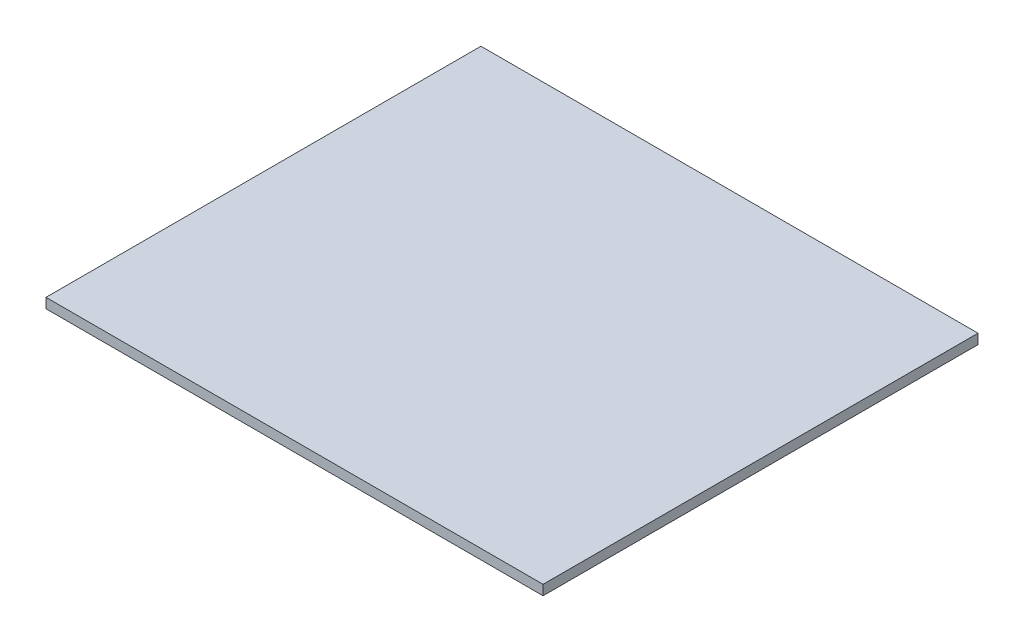
ISO-10303-21;
HEADER;
FILE_DESCRIPTION(('STEP AP214'),'2;1');
FILE_NAME('part.step','',(''),(''),'','','');
FILE_SCHEMA(('AUTOMOTIVE_DESIGN { 1 0 10303 214 1 1 1 1 }'));
ENDSEC;
DATA;
#1=APPLICATION_CONTEXT('core data for automotive mechanical design processes');
#2=APPLICATION_PROTOCOL_DEFINITION('international standard','automotive_design',2000,#1);
#3=PRODUCT_CONTEXT('',#1,'mechanical');
#4=PRODUCT('Part','Part','',(#3));
#5=PRODUCT_RELATED_PRODUCT_CATEGORY('part','',(#4));
#6=PRODUCT_DEFINITION_FORMATION('','',#4);
#7=PRODUCT_DEFINITION_CONTEXT('part definition',#1,'design');
#8=PRODUCT_DEFINITION('design','',#6,#7);
#9=PRODUCT_DEFINITION_SHAPE('','',#8);
#10=(LENGTH_UNIT() NAMED_UNIT(*) SI_UNIT(.MILLI.,.METRE.));
#11=(NAMED_UNIT(*) PLANE_ANGLE_UNIT() SI_UNIT($,.RADIAN.));
#12=(NAMED_UNIT(*) SI_UNIT($,.STERADIAN.) SOLID_ANGLE_UNIT());
#13=UNCERTAINTY_MEASURE_WITH_UNIT(LENGTH_MEASURE(1.E-05),#10,'distance_accuracy_value','');
#14=(GEOMETRIC_REPRESENTATION_CONTEXT(3) GLOBAL_UNCERTAINTY_ASSIGNED_CONTEXT((#13)) GLOBAL_UNIT_ASSIGNED_CONTEXT((#10,
#11,#12)) REPRESENTATION_CONTEXT('',''));
#15=CARTESIAN_POINT('',(0.,0.,0.));
#16=DIRECTION('',(0.,0.,1.));
#17=DIRECTION('',(1.,0.,0.));
#18=AXIS2_PLACEMENT_3D('',#15,#16,#17);
#19=CARTESIAN_POINT('',(0.,1.6,0.));
#20=DIRECTION('',(1.,0.,0.));
#21=DIRECTION('',(0.,0.,-1.));
#22=AXIS2_PLACEMENT_3D('',#19,#20,#21);
#23=PLANE('',#22);
#24=DIRECTION('',(0.,0.,1.));
#25=VECTOR('',#24,1.);
#26=CARTESIAN_POINT('',(0.,0.,0.));
#27=LINE('',#26,#25);
#28=CARTESIAN_POINT('',(0.,0.,-70.));
#29=VERTEX_POINT('',#28);
#30=CARTESIAN_POINT('',(0.,0.,0.));
#31=VERTEX_POINT('',#30);
#32=EDGE_CURVE('E96',#29,#31,#27,.T.);
#33=ORIENTED_EDGE('',*,*,#32,.T.);
#34=DIRECTION('',(0.,-1.,0.));
#35=VECTOR('',#34,1.);
#36=CARTESIAN_POINT('',(0.,1.6,0.));
#37=LINE('',#36,#35);
#38=CARTESIAN_POINT('',(0.,1.6,0.));
#39=VERTEX_POINT('',#38);
#40=EDGE_CURVE('E11',#39,#31,#37,.T.);
#41=ORIENTED_EDGE('',*,*,#40,.F.);
#42=DIRECTION('',(0.,0.,1.));
#43=VECTOR('',#42,1.);
#44=CARTESIAN_POINT('',(0.,1.6,0.));
#45=LINE('',#44,#43);
#46=CARTESIAN_POINT('',(0.,1.6,-70.));
#47=VERTEX_POINT('',#46);
#48=EDGE_CURVE('E84',#47,#39,#45,.T.);
#49=ORIENTED_EDGE('',*,*,#48,.F.);
#50=DIRECTION('',(0.,-1.,0.));
#51=VECTOR('',#50,1.);
#52=CARTESIAN_POINT('',(0.,1.6,-70.));
#53=LINE('',#52,#51);
#54=EDGE_CURVE('E92',#47,#29,#53,.T.);
#55=ORIENTED_EDGE('',*,*,#54,.T.);
#56=EDGE_LOOP('',(#33,#41,#49,#55));
#57=FACE_BOUND('',#56,.T.);
#58=ADVANCED_FACE('F33',(#57),#23,.F.);
#59=CARTESIAN_POINT('',(0.,1.6,0.));
#60=DIRECTION('',(0.,0.,-1.));
#61=DIRECTION('',(-1.,0.,0.));
#62=AXIS2_PLACEMENT_3D('',#59,#60,#61);
#63=PLANE('',#62);
#64=DIRECTION('',(1.,0.,0.));
#65=VECTOR('',#64,1.);
#66=CARTESIAN_POINT('',(0.,0.,0.));
#67=LINE('',#66,#65);
#68=CARTESIAN_POINT('',(80.,0.,0.));
#69=VERTEX_POINT('',#68);
#70=EDGE_CURVE('E88',#31,#69,#67,.T.);
#71=ORIENTED_EDGE('',*,*,#70,.T.);
#72=DIRECTION('',(0.,-1.,0.));
#73=VECTOR('',#72,1.);
#74=CARTESIAN_POINT('',(80.,1.6,0.));
#75=LINE('',#74,#73);
#76=CARTESIAN_POINT('',(80.,1.6,0.));
#77=VERTEX_POINT('',#76);
#78=EDGE_CURVE('E41',#77,#69,#75,.T.);
#79=ORIENTED_EDGE('',*,*,#78,.F.);
#80=DIRECTION('',(1.,0.,0.));
#81=VECTOR('',#80,1.);
#82=CARTESIAN_POINT('',(0.,1.6,0.));
#83=LINE('',#82,#81);
#84=EDGE_CURVE('E79',#39,#77,#83,.T.);
#85=ORIENTED_EDGE('',*,*,#84,.F.);
#86=ORIENTED_EDGE('',*,*,#40,.T.);
#87=EDGE_LOOP('',(#71,#79,#85,#86));
#88=FACE_BOUND('',#87,.T.);
#89=ADVANCED_FACE('F87',(#88),#63,.F.);
#90=CARTESIAN_POINT('',(80.,1.6,0.));
#91=DIRECTION('',(-1.,0.,0.));
#92=DIRECTION('',(0.,0.,1.));
#93=AXIS2_PLACEMENT_3D('',#90,#91,#92);
#94=PLANE('',#93);
#95=DIRECTION('',(0.,0.,-1.));
#96=VECTOR('',#95,1.);
#97=CARTESIAN_POINT('',(80.,0.,0.));
#98=LINE('',#97,#96);
#99=CARTESIAN_POINT('',(80.,0.,-70.));
#100=VERTEX_POINT('',#99);
#101=EDGE_CURVE('E66',#69,#100,#98,.T.);
#102=ORIENTED_EDGE('',*,*,#101,.T.);
#103=DIRECTION('',(0.,-1.,0.));
#104=VECTOR('',#103,1.);
#105=CARTESIAN_POINT('',(80.,1.6,-70.));
#106=LINE('',#105,#104);
#107=CARTESIAN_POINT('',(80.,1.6,-70.));
#108=VERTEX_POINT('',#107);
#109=EDGE_CURVE('E89',#108,#100,#106,.T.);
#110=ORIENTED_EDGE('',*,*,#109,.F.);
#111=DIRECTION('',(0.,0.,-1.));
#112=VECTOR('',#111,1.);
#113=CARTESIAN_POINT('',(80.,1.6,0.));
#114=LINE('',#113,#112);
#115=EDGE_CURVE('E82',#77,#108,#114,.T.);
#116=ORIENTED_EDGE('',*,*,#115,.F.);
#117=ORIENTED_EDGE('',*,*,#78,.T.);
#118=EDGE_LOOP('',(#102,#110,#116,#117));
#119=FACE_BOUND('',#118,.T.);
#120=ADVANCED_FACE('F90',(#119),#94,.F.);
#121=CARTESIAN_POINT('',(0.,1.6,-70.));
#122=DIRECTION('',(0.,0.,1.));
#123=DIRECTION('',(1.,0.,0.));
#124=AXIS2_PLACEMENT_3D('',#121,#122,#123);
#125=PLANE('',#124);
#126=DIRECTION('',(-1.,0.,0.));
#127=VECTOR('',#126,1.);
#128=CARTESIAN_POINT('',(0.,0.,-70.));
#129=LINE('',#128,#127);
#130=EDGE_CURVE('E72',#100,#29,#129,.T.);
#131=ORIENTED_EDGE('',*,*,#130,.T.);
#132=ORIENTED_EDGE('',*,*,#54,.F.);
#133=DIRECTION('',(-1.,0.,0.));
#134=VECTOR('',#133,1.);
#135=CARTESIAN_POINT('',(0.,1.6,-70.));
#136=LINE('',#135,#134);
#137=EDGE_CURVE('E49',#108,#47,#136,.T.);
#138=ORIENTED_EDGE('',*,*,#137,.F.);
#139=ORIENTED_EDGE('',*,*,#109,.T.);
#140=EDGE_LOOP('',(#131,#132,#138,#139));
#141=FACE_BOUND('',#140,.T.);
#142=ADVANCED_FACE('F103',(#141),#125,.F.);
#143=CARTESIAN_POINT('',(0.,1.6,0.));
#144=DIRECTION('',(0.,-1.,0.));
#145=DIRECTION('',(0.,0.,-1.));
#146=AXIS2_PLACEMENT_3D('',#143,#144,#145);
#147=PLANE('',#146);
#148=ORIENTED_EDGE('',*,*,#48,.T.);
#149=ORIENTED_EDGE('',*,*,#84,.T.);
#150=ORIENTED_EDGE('',*,*,#115,.T.);
#151=ORIENTED_EDGE('',*,*,#137,.T.);
#152=EDGE_LOOP('',(#148,#149,#150,#151));
#153=FACE_BOUND('',#152,.T.);
#154=ADVANCED_FACE('F80',(#153),#147,.F.);
#155=CARTESIAN_POINT('',(0.,0.,0.));
#156=DIRECTION('',(0.,-1.,0.));
#157=DIRECTION('',(0.,0.,-1.));
#158=AXIS2_PLACEMENT_3D('',#155,#156,#157);
#159=PLANE('',#158);
#160=ORIENTED_EDGE('',*,*,#32,.F.);
#161=ORIENTED_EDGE('',*,*,#130,.F.);
#162=ORIENTED_EDGE('',*,*,#101,.F.);
#163=ORIENTED_EDGE('',*,*,#70,.F.);
#164=EDGE_LOOP('',(#160,#161,#162,#163));
#165=FACE_BOUND('',#164,.T.);
#166=ADVANCED_FACE('F106',(#165),#159,.T.);
#167=CLOSED_SHELL('',(#58,#89,#120,#142,#154,#166));
#168=MANIFOLD_SOLID_BREP('B2',#167);
#169=ADVANCED_BREP_SHAPE_REPRESENTATION('',(#18,#168),#14);
#170=SHAPE_DEFINITION_REPRESENTATION(#9,#169);
ENDSEC;
END-ISO-10303-21;
